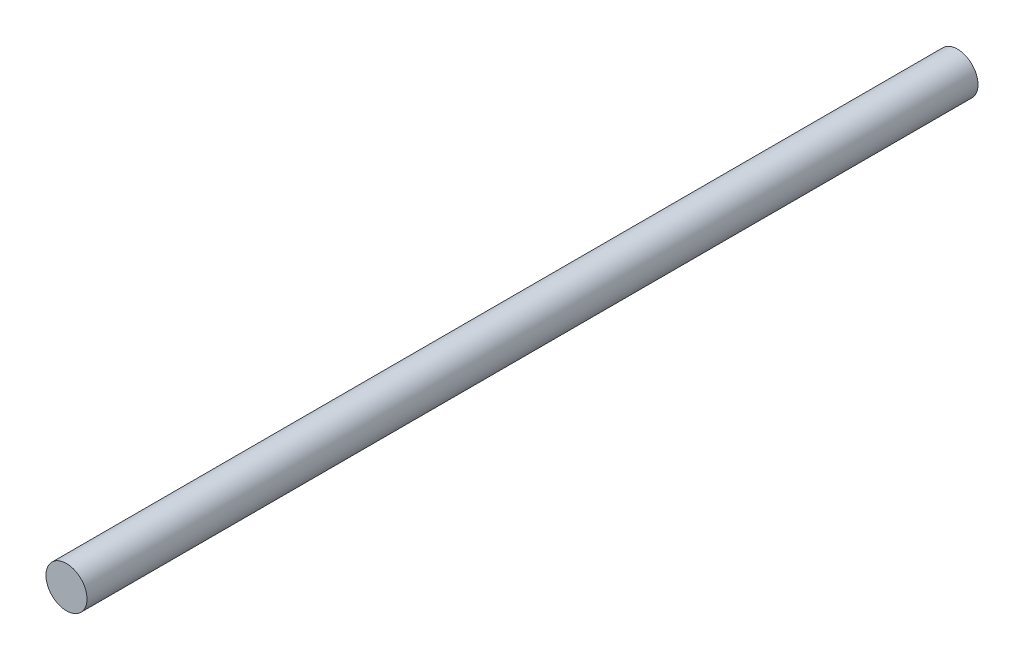
ISO-10303-21;
HEADER;
FILE_DESCRIPTION(('STEP AP214'),'2;1');
FILE_NAME('part.step','',(''),(''),'','','');
FILE_SCHEMA(('AUTOMOTIVE_DESIGN { 1 0 10303 214 1 1 1 1 }'));
ENDSEC;
DATA;
#1=APPLICATION_CONTEXT('core data for automotive mechanical design processes');
#2=APPLICATION_PROTOCOL_DEFINITION('international standard','automotive_design',2000,#1);
#3=PRODUCT_CONTEXT('',#1,'mechanical');
#4=PRODUCT('Part','Part','',(#3));
#5=PRODUCT_RELATED_PRODUCT_CATEGORY('part','',(#4));
#6=PRODUCT_DEFINITION_FORMATION('','',#4);
#7=PRODUCT_DEFINITION_CONTEXT('part definition',#1,'design');
#8=PRODUCT_DEFINITION('design','',#6,#7);
#9=PRODUCT_DEFINITION_SHAPE('','',#8);
#10=(LENGTH_UNIT() NAMED_UNIT(*) SI_UNIT(.MILLI.,.METRE.));
#11=(NAMED_UNIT(*) PLANE_ANGLE_UNIT() SI_UNIT($,.RADIAN.));
#12=(NAMED_UNIT(*) SI_UNIT($,.STERADIAN.) SOLID_ANGLE_UNIT());
#13=UNCERTAINTY_MEASURE_WITH_UNIT(LENGTH_MEASURE(1.E-05),#10,'distance_accuracy_value','');
#14=(GEOMETRIC_REPRESENTATION_CONTEXT(3) GLOBAL_UNCERTAINTY_ASSIGNED_CONTEXT((#13)) GLOBAL_UNIT_ASSIGNED_CONTEXT((#10,
#11,#12)) REPRESENTATION_CONTEXT('',''));
#15=CARTESIAN_POINT('',(0.,0.,0.));
#16=DIRECTION('',(0.,0.,1.));
#17=DIRECTION('',(1.,0.,0.));
#18=AXIS2_PLACEMENT_3D('',#15,#16,#17);
#19=CARTESIAN_POINT('',(20.0000009536743,6.99999981549345,125.7));
#20=DIRECTION('',(0.,0.,-1.));
#21=DIRECTION('',(-1.,0.,0.));
#22=AXIS2_PLACEMENT_3D('',#19,#20,#21);
#23=CYLINDRICAL_SURFACE('',#22,2.89512777983602);
#24=CARTESIAN_POINT('',(20.0000009536743,6.99999981549345,125.7));
#25=DIRECTION('',(0.,0.,1.));
#26=DIRECTION('',(1.,0.,0.));
#27=AXIS2_PLACEMENT_3D('',#24,#25,#26);
#28=CIRCLE('',#27,2.89512777983602);
#29=CARTESIAN_POINT('',(22.8951287335103,6.99999981549345,125.7));
#30=VERTEX_POINT('',#29);
#31=EDGE_CURVE('E10',#30,#30,#28,.T.);
#32=ORIENTED_EDGE('',*,*,#31,.F.);
#33=EDGE_LOOP('',(#32));
#34=FACE_BOUND('',#33,.T.);
#35=CARTESIAN_POINT('',(20.0000009536743,6.99999981549345,0.));
#36=DIRECTION('',(0.,0.,1.));
#37=DIRECTION('',(1.,0.,0.));
#38=AXIS2_PLACEMENT_3D('',#35,#36,#37);
#39=CIRCLE('',#38,2.89512777983602);
#40=CARTESIAN_POINT('',(22.8951287335103,6.99999981549345,0.));
#41=VERTEX_POINT('',#40);
#42=EDGE_CURVE('E44',#41,#41,#39,.T.);
#43=ORIENTED_EDGE('',*,*,#42,.T.);
#44=EDGE_LOOP('',(#43));
#45=FACE_BOUND('',#44,.T.);
#46=ADVANCED_FACE('F41',(#34,#45),#23,.T.);
#47=CARTESIAN_POINT('',(20.0000009536743,6.99999981549345,125.7));
#48=DIRECTION('',(0.,0.,1.));
#49=DIRECTION('',(1.,0.,0.));
#50=AXIS2_PLACEMENT_3D('',#47,#48,#49);
#51=PLANE('',#50);
#52=ORIENTED_EDGE('',*,*,#31,.T.);
#53=EDGE_LOOP('',(#52));
#54=FACE_BOUND('',#53,.T.);
#55=ADVANCED_FACE('F58',(#54),#51,.T.);
#56=CARTESIAN_POINT('',(20.0000009536743,6.99999981549345,0.));
#57=DIRECTION('',(0.,0.,1.));
#58=DIRECTION('',(1.,0.,0.));
#59=AXIS2_PLACEMENT_3D('',#56,#57,#58);
#60=PLANE('',#59);
#61=ORIENTED_EDGE('',*,*,#42,.F.);
#62=EDGE_LOOP('',(#61));
#63=FACE_BOUND('',#62,.T.);
#64=ADVANCED_FACE('F56',(#63),#60,.F.);
#65=CLOSED_SHELL('',(#46,#55,#64));
#66=MANIFOLD_SOLID_BREP('B2',#65);
#67=ADVANCED_BREP_SHAPE_REPRESENTATION('',(#18,#66),#14);
#68=SHAPE_DEFINITION_REPRESENTATION(#9,#67);
ENDSEC;
END-ISO-10303-21;
